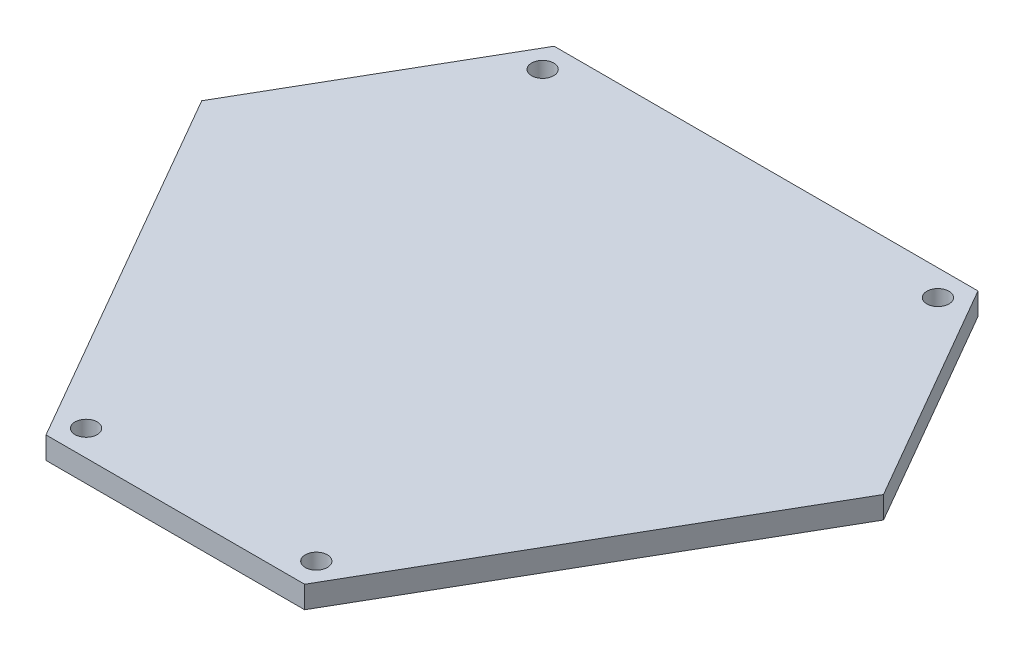
ISO-10303-21;
HEADER;
FILE_DESCRIPTION(('STEP AP214'),'2;1');
FILE_NAME('part.step','',(''),(''),'','','');
FILE_SCHEMA(('AUTOMOTIVE_DESIGN { 1 0 10303 214 1 1 1 1 }'));
ENDSEC;
DATA;
#1=APPLICATION_CONTEXT('core data for automotive mechanical design processes');
#2=APPLICATION_PROTOCOL_DEFINITION('international standard','automotive_design',2000,#1);
#3=PRODUCT_CONTEXT('',#1,'mechanical');
#4=PRODUCT('Part','Part','',(#3));
#5=PRODUCT_RELATED_PRODUCT_CATEGORY('part','',(#4));
#6=PRODUCT_DEFINITION_FORMATION('','',#4);
#7=PRODUCT_DEFINITION_CONTEXT('part definition',#1,'design');
#8=PRODUCT_DEFINITION('design','',#6,#7);
#9=PRODUCT_DEFINITION_SHAPE('','',#8);
#10=(LENGTH_UNIT() NAMED_UNIT(*) SI_UNIT(.MILLI.,.METRE.));
#11=(NAMED_UNIT(*) PLANE_ANGLE_UNIT() SI_UNIT($,.RADIAN.));
#12=(NAMED_UNIT(*) SI_UNIT($,.STERADIAN.) SOLID_ANGLE_UNIT());
#13=UNCERTAINTY_MEASURE_WITH_UNIT(LENGTH_MEASURE(1.E-05),#10,'distance_accuracy_value','');
#14=(GEOMETRIC_REPRESENTATION_CONTEXT(3) GLOBAL_UNCERTAINTY_ASSIGNED_CONTEXT((#13)) GLOBAL_UNIT_ASSIGNED_CONTEXT((#10,
#11,#12)) REPRESENTATION_CONTEXT('',''));
#15=CARTESIAN_POINT('',(0.,0.,0.));
#16=DIRECTION('',(0.,0.,1.));
#17=DIRECTION('',(1.,0.,0.));
#18=AXIS2_PLACEMENT_3D('',#15,#16,#17);
#19=CARTESIAN_POINT('',(0.,3.,-129.9));
#20=DIRECTION('',(-0.866019052628739,0.,0.500011000363013));
#21=DIRECTION('',(0.500011000363013,0.,0.866019052628739));
#22=AXIS2_PLACEMENT_3D('',#19,#20,#21);
#23=PLANE('',#22);
#24=DIRECTION('',(-0.500011000363013,0.,-0.866019052628739));
#25=VECTOR('',#24,1.);
#26=CARTESIAN_POINT('',(0.,0.,-129.9));
#27=LINE('',#26,#25);
#28=CARTESIAN_POINT('',(46.2474247660202,0.,-49.799460305253));
#29=VERTEX_POINT('',#28);
#30=CARTESIAN_POINT('',(28.7426018017677,0.,-80.1178136793383));
#31=VERTEX_POINT('',#30);
#32=EDGE_CURVE('E113',#29,#31,#27,.T.);
#33=ORIENTED_EDGE('',*,*,#32,.T.);
#34=DIRECTION('',(0.,1.,0.));
#35=VECTOR('',#34,1.);
#36=CARTESIAN_POINT('',(28.7426018017677,0.,-80.1178136793383));
#37=LINE('',#36,#35);
#38=CARTESIAN_POINT('',(28.7426018017677,3.,-80.1178136793383));
#39=VERTEX_POINT('',#38);
#40=EDGE_CURVE('E96',#31,#39,#37,.T.);
#41=ORIENTED_EDGE('',*,*,#40,.T.);
#42=DIRECTION('',(-0.500011000363013,0.,-0.866019052628739));
#43=VECTOR('',#42,1.);
#44=CARTESIAN_POINT('',(0.,3.,-129.9));
#45=LINE('',#44,#43);
#46=CARTESIAN_POINT('',(46.2474247660202,3.,-49.799460305253));
#47=VERTEX_POINT('',#46);
#48=EDGE_CURVE('E115',#47,#39,#45,.T.);
#49=ORIENTED_EDGE('',*,*,#48,.F.);
#50=DIRECTION('',(0.,1.,0.));
#51=VECTOR('',#50,1.);
#52=CARTESIAN_POINT('',(46.2474247660202,0.,-49.799460305253));
#53=LINE('',#52,#51);
#54=EDGE_CURVE('E125',#29,#47,#53,.T.);
#55=ORIENTED_EDGE('',*,*,#54,.F.);
#56=EDGE_LOOP('',(#33,#41,#49,#55));
#57=FACE_BOUND('',#56,.T.);
#58=ADVANCED_FACE('F37',(#57),#23,.F.);
#59=CARTESIAN_POINT('',(0.,3.,-129.9));
#60=DIRECTION('',(0.866019052628739,0.,0.500011000363013));
#61=DIRECTION('',(0.500011000363013,0.,-0.866019052628739));
#62=AXIS2_PLACEMENT_3D('',#59,#60,#61);
#63=PLANE('',#62);
#64=DIRECTION('',(-0.500011000363013,0.,0.866019052628739));
#65=VECTOR('',#64,1.);
#66=CARTESIAN_POINT('',(0.,3.,-129.9));
#67=LINE('',#66,#65);
#68=CARTESIAN_POINT('',(-28.7426018017677,3.,-80.1178136793383));
#69=VERTEX_POINT('',#68);
#70=CARTESIAN_POINT('',(-46.2392583536948,3.,-49.8136045314006));
#71=VERTEX_POINT('',#70);
#72=EDGE_CURVE('E45',#69,#71,#67,.T.);
#73=ORIENTED_EDGE('',*,*,#72,.F.);
#74=DIRECTION('',(0.,1.,0.));
#75=VECTOR('',#74,1.);
#76=CARTESIAN_POINT('',(-28.7426018017677,0.,-80.1178136793383));
#77=LINE('',#76,#75);
#78=CARTESIAN_POINT('',(-28.7426018017677,0.,-80.1178136793383));
#79=VERTEX_POINT('',#78);
#80=EDGE_CURVE('E93',#79,#69,#77,.T.);
#81=ORIENTED_EDGE('',*,*,#80,.F.);
#82=DIRECTION('',(-0.500011000363013,0.,0.866019052628739));
#83=VECTOR('',#82,1.);
#84=CARTESIAN_POINT('',(0.,0.,-129.9));
#85=LINE('',#84,#83);
#86=CARTESIAN_POINT('',(-46.2392583536948,0.,-49.8136045314006));
#87=VERTEX_POINT('',#86);
#88=EDGE_CURVE('E107',#79,#87,#85,.T.);
#89=ORIENTED_EDGE('',*,*,#88,.T.);
#90=DIRECTION('',(0.,1.,0.));
#91=VECTOR('',#90,1.);
#92=CARTESIAN_POINT('',(-46.2392583536948,0.,-49.8136045314006));
#93=LINE('',#92,#91);
#94=EDGE_CURVE('E53',#87,#71,#93,.T.);
#95=ORIENTED_EDGE('',*,*,#94,.T.);
#96=EDGE_LOOP('',(#73,#81,#89,#95));
#97=FACE_BOUND('',#96,.T.);
#98=ADVANCED_FACE('F106',(#97),#63,.F.);
#99=CARTESIAN_POINT('',(-75.,3.,0.));
#100=DIRECTION('',(0.,0.,-1.));
#101=DIRECTION('',(-1.,0.,0.));
#102=AXIS2_PLACEMENT_3D('',#99,#100,#101);
#103=PLANE('',#102);
#104=DIRECTION('',(1.,0.,0.));
#105=VECTOR('',#104,1.);
#106=CARTESIAN_POINT('',(-75.,0.,0.));
#107=LINE('',#106,#105);
#108=CARTESIAN_POINT('',(-17.5486076652013,0.,0.));
#109=VERTEX_POINT('',#108);
#110=CARTESIAN_POINT('',(17.5322304145022,0.,0.));
#111=VERTEX_POINT('',#110);
#112=EDGE_CURVE('E40',#109,#111,#107,.T.);
#113=ORIENTED_EDGE('',*,*,#112,.T.);
#114=DIRECTION('',(0.,1.,0.));
#115=VECTOR('',#114,1.);
#116=CARTESIAN_POINT('',(17.5322304145022,0.,0.));
#117=LINE('',#116,#115);
#118=CARTESIAN_POINT('',(17.5322304145022,3.,0.));
#119=VERTEX_POINT('',#118);
#120=EDGE_CURVE('E61',#111,#119,#117,.T.);
#121=ORIENTED_EDGE('',*,*,#120,.T.);
#122=DIRECTION('',(1.,0.,0.));
#123=VECTOR('',#122,1.);
#124=CARTESIAN_POINT('',(-75.,3.,0.));
#125=LINE('',#124,#123);
#126=CARTESIAN_POINT('',(-17.5486076652013,3.,0.));
#127=VERTEX_POINT('',#126);
#128=EDGE_CURVE('E11',#127,#119,#125,.T.);
#129=ORIENTED_EDGE('',*,*,#128,.F.);
#130=DIRECTION('',(0.,1.,0.));
#131=VECTOR('',#130,1.);
#132=CARTESIAN_POINT('',(-17.5486076652013,0.,0.));
#133=LINE('',#132,#131);
#134=EDGE_CURVE('E123',#109,#127,#133,.T.);
#135=ORIENTED_EDGE('',*,*,#134,.F.);
#136=EDGE_LOOP('',(#113,#121,#129,#135));
#137=FACE_BOUND('',#136,.T.);
#138=ADVANCED_FACE('F173',(#137),#103,.F.);
#139=CARTESIAN_POINT('',(0.,3.,0.));
#140=DIRECTION('',(0.,-1.,0.));
#141=DIRECTION('',(0.,0.,-1.));
#142=AXIS2_PLACEMENT_3D('',#139,#140,#141);
#143=PLANE('',#142);
#144=CARTESIAN_POINT('',(-26.806110128664,3.,-76.6178136793383));
#145=DIRECTION('',(0.,1.,0.));
#146=DIRECTION('',(0.,0.,1.));
#147=AXIS2_PLACEMENT_3D('',#144,#145,#146);
#148=CIRCLE('',#147,1.5);
#149=CARTESIAN_POINT('',(-26.806110128664,3.,-75.1178136793383));
#150=VERTEX_POINT('',#149);
#151=EDGE_CURVE('E150',#150,#150,#148,.T.);
#152=ORIENTED_EDGE('',*,*,#151,.F.);
#153=EDGE_LOOP('',(#152));
#154=FACE_BOUND('',#153,.T.);
#155=CARTESIAN_POINT('',(15.6121159920976,3.,-3.5));
#156=DIRECTION('',(0.,1.,0.));
#157=DIRECTION('',(0.,0.,-1.));
#158=AXIS2_PLACEMENT_3D('',#155,#156,#157);
#159=CIRCLE('',#158,1.5);
#160=CARTESIAN_POINT('',(15.6121159920976,3.,-5.));
#161=VERTEX_POINT('',#160);
#162=EDGE_CURVE('E141',#161,#161,#159,.T.);
#163=ORIENTED_EDGE('',*,*,#162,.F.);
#164=EDGE_LOOP('',(#163));
#165=FACE_BOUND('',#164,.T.);
#166=CARTESIAN_POINT('',(-15.6121159920976,3.,-3.5));
#167=DIRECTION('',(0.,1.,0.));
#168=DIRECTION('',(0.,0.,1.));
#169=AXIS2_PLACEMENT_3D('',#166,#167,#168);
#170=CIRCLE('',#169,1.5);
#171=CARTESIAN_POINT('',(-15.6121159920976,3.,-2.00000000000001));
#172=VERTEX_POINT('',#171);
#173=EDGE_CURVE('E140',#172,#172,#170,.T.);
#174=ORIENTED_EDGE('',*,*,#173,.F.);
#175=EDGE_LOOP('',(#174));
#176=FACE_BOUND('',#175,.T.);
#177=CARTESIAN_POINT('',(26.806110128664,3.,-76.6178136793383));
#178=DIRECTION('',(0.,1.,0.));
#179=DIRECTION('',(0.,0.,-1.));
#180=AXIS2_PLACEMENT_3D('',#177,#178,#179);
#181=CIRCLE('',#180,1.5);
#182=CARTESIAN_POINT('',(26.806110128664,3.,-78.1178136793383));
#183=VERTEX_POINT('',#182);
#184=EDGE_CURVE('E147',#183,#183,#181,.T.);
#185=ORIENTED_EDGE('',*,*,#184,.F.);
#186=EDGE_LOOP('',(#185));
#187=FACE_BOUND('',#186,.T.);
#188=ORIENTED_EDGE('',*,*,#48,.T.);
#189=DIRECTION('',(1.,0.,0.));
#190=VECTOR('',#189,1.);
#191=CARTESIAN_POINT('',(-28.7426018017677,3.,-80.1178136793383));
#192=LINE('',#191,#190);
#193=EDGE_CURVE('E101',#69,#39,#192,.T.);
#194=ORIENTED_EDGE('',*,*,#193,.F.);
#195=ORIENTED_EDGE('',*,*,#72,.T.);
#196=DIRECTION('',(-0.499096269822187,0.,-0.866546544306524));
#197=VECTOR('',#196,1.);
#198=CARTESIAN_POINT('',(-46.2392583536948,3.,-49.8136045314006));
#199=LINE('',#198,#197);
#200=EDGE_CURVE('E122',#127,#71,#199,.T.);
#201=ORIENTED_EDGE('',*,*,#200,.F.);
#202=ORIENTED_EDGE('',*,*,#128,.T.);
#203=DIRECTION('',(-0.499523226003708,0.,0.866300494449154));
#204=VECTOR('',#203,1.);
#205=CARTESIAN_POINT('',(46.2474247660202,3.,-49.799460305253));
#206=LINE('',#205,#204);
#207=EDGE_CURVE('E131',#47,#119,#206,.T.);
#208=ORIENTED_EDGE('',*,*,#207,.F.);
#209=EDGE_LOOP('',(#188,#194,#195,#201,#202,#208));
#210=FACE_BOUND('',#209,.T.);
#211=ADVANCED_FACE('F170',(#154,#165,#176,#187,#210),#143,.F.);
#212=CARTESIAN_POINT('',(0.,0.,0.));
#213=DIRECTION('',(0.,-1.,0.));
#214=DIRECTION('',(0.,0.,-1.));
#215=AXIS2_PLACEMENT_3D('',#212,#213,#214);
#216=PLANE('',#215);
#217=CARTESIAN_POINT('',(-26.806110128664,0.,-76.6178136793383));
#218=DIRECTION('',(0.,1.,0.));
#219=DIRECTION('',(0.,0.,1.));
#220=AXIS2_PLACEMENT_3D('',#217,#218,#219);
#221=CIRCLE('',#220,1.5);
#222=CARTESIAN_POINT('',(-26.806110128664,0.,-75.1178136793383));
#223=VERTEX_POINT('',#222);
#224=EDGE_CURVE('E127',#223,#223,#221,.T.);
#225=ORIENTED_EDGE('',*,*,#224,.T.);
#226=EDGE_LOOP('',(#225));
#227=FACE_BOUND('',#226,.T.);
#228=CARTESIAN_POINT('',(15.6121159920976,0.,-3.5));
#229=DIRECTION('',(0.,1.,0.));
#230=DIRECTION('',(0.,0.,-1.));
#231=AXIS2_PLACEMENT_3D('',#228,#229,#230);
#232=CIRCLE('',#231,1.5);
#233=CARTESIAN_POINT('',(15.6121159920976,0.,-5.));
#234=VERTEX_POINT('',#233);
#235=EDGE_CURVE('E151',#234,#234,#232,.T.);
#236=ORIENTED_EDGE('',*,*,#235,.T.);
#237=EDGE_LOOP('',(#236));
#238=FACE_BOUND('',#237,.T.);
#239=CARTESIAN_POINT('',(-15.6121159920976,0.,-3.5));
#240=DIRECTION('',(0.,1.,0.));
#241=DIRECTION('',(0.,0.,1.));
#242=AXIS2_PLACEMENT_3D('',#239,#240,#241);
#243=CIRCLE('',#242,1.5);
#244=CARTESIAN_POINT('',(-15.6121159920976,0.,-2.00000000000001));
#245=VERTEX_POINT('',#244);
#246=EDGE_CURVE('E137',#245,#245,#243,.T.);
#247=ORIENTED_EDGE('',*,*,#246,.T.);
#248=EDGE_LOOP('',(#247));
#249=FACE_BOUND('',#248,.T.);
#250=CARTESIAN_POINT('',(26.806110128664,0.,-76.6178136793383));
#251=DIRECTION('',(0.,1.,0.));
#252=DIRECTION('',(0.,0.,-1.));
#253=AXIS2_PLACEMENT_3D('',#250,#251,#252);
#254=CIRCLE('',#253,1.5);
#255=CARTESIAN_POINT('',(26.806110128664,0.,-78.1178136793383));
#256=VERTEX_POINT('',#255);
#257=EDGE_CURVE('E144',#256,#256,#254,.T.);
#258=ORIENTED_EDGE('',*,*,#257,.T.);
#259=EDGE_LOOP('',(#258));
#260=FACE_BOUND('',#259,.T.);
#261=DIRECTION('',(1.,0.,0.));
#262=VECTOR('',#261,1.);
#263=CARTESIAN_POINT('',(-28.7426018017677,0.,-80.1178136793383));
#264=LINE('',#263,#262);
#265=EDGE_CURVE('E90',#79,#31,#264,.T.);
#266=ORIENTED_EDGE('',*,*,#265,.T.);
#267=ORIENTED_EDGE('',*,*,#32,.F.);
#268=DIRECTION('',(-0.499523226003708,0.,0.866300494449154));
#269=VECTOR('',#268,1.);
#270=CARTESIAN_POINT('',(46.2474247660202,0.,-49.799460305253));
#271=LINE('',#270,#269);
#272=EDGE_CURVE('E129',#29,#111,#271,.T.);
#273=ORIENTED_EDGE('',*,*,#272,.T.);
#274=ORIENTED_EDGE('',*,*,#112,.F.);
#275=DIRECTION('',(-0.499096269822187,0.,-0.866546544306524));
#276=VECTOR('',#275,1.);
#277=CARTESIAN_POINT('',(-46.2392583536948,0.,-49.8136045314006));
#278=LINE('',#277,#276);
#279=EDGE_CURVE('E112',#109,#87,#278,.T.);
#280=ORIENTED_EDGE('',*,*,#279,.T.);
#281=ORIENTED_EDGE('',*,*,#88,.F.);
#282=EDGE_LOOP('',(#266,#267,#273,#274,#280,#281));
#283=FACE_BOUND('',#282,.T.);
#284=ADVANCED_FACE('F110',(#227,#238,#249,#260,#283),#216,.T.);
#285=CARTESIAN_POINT('',(-46.2392583536948,0.,-49.8136045314006));
#286=DIRECTION('',(0.866546544306524,0.,-0.499096269822187));
#287=DIRECTION('',(-0.499096269822187,0.,-0.866546544306524));
#288=AXIS2_PLACEMENT_3D('',#285,#286,#287);
#289=PLANE('',#288);
#290=ORIENTED_EDGE('',*,*,#200,.T.);
#291=ORIENTED_EDGE('',*,*,#94,.F.);
#292=ORIENTED_EDGE('',*,*,#279,.F.);
#293=ORIENTED_EDGE('',*,*,#134,.T.);
#294=EDGE_LOOP('',(#290,#291,#292,#293));
#295=FACE_BOUND('',#294,.T.);
#296=ADVANCED_FACE('F189',(#295),#289,.F.);
#297=CARTESIAN_POINT('',(46.2474247660202,0.,-49.799460305253));
#298=DIRECTION('',(-0.866300494449154,0.,-0.499523226003708));
#299=DIRECTION('',(-0.499523226003708,0.,0.866300494449154));
#300=AXIS2_PLACEMENT_3D('',#297,#298,#299);
#301=PLANE('',#300);
#302=ORIENTED_EDGE('',*,*,#207,.T.);
#303=ORIENTED_EDGE('',*,*,#120,.F.);
#304=ORIENTED_EDGE('',*,*,#272,.F.);
#305=ORIENTED_EDGE('',*,*,#54,.T.);
#306=EDGE_LOOP('',(#302,#303,#304,#305));
#307=FACE_BOUND('',#306,.T.);
#308=ADVANCED_FACE('F191',(#307),#301,.F.);
#309=CARTESIAN_POINT('',(-28.7426018017677,0.,-80.1178136793383));
#310=DIRECTION('',(0.,0.,1.));
#311=DIRECTION('',(1.,0.,0.));
#312=AXIS2_PLACEMENT_3D('',#309,#310,#311);
#313=PLANE('',#312);
#314=ORIENTED_EDGE('',*,*,#193,.T.);
#315=ORIENTED_EDGE('',*,*,#40,.F.);
#316=ORIENTED_EDGE('',*,*,#265,.F.);
#317=ORIENTED_EDGE('',*,*,#80,.T.);
#318=EDGE_LOOP('',(#314,#315,#316,#317));
#319=FACE_BOUND('',#318,.T.);
#320=ADVANCED_FACE('F92',(#319),#313,.F.);
#321=CARTESIAN_POINT('',(26.806110128664,0.,-76.6178136793383));
#322=DIRECTION('',(0.,1.,0.));
#323=DIRECTION('',(0.,0.,1.));
#324=AXIS2_PLACEMENT_3D('',#321,#322,#323);
#325=CYLINDRICAL_SURFACE('',#324,1.5);
#326=ORIENTED_EDGE('',*,*,#257,.F.);
#327=EDGE_LOOP('',(#326));
#328=FACE_BOUND('',#327,.T.);
#329=ORIENTED_EDGE('',*,*,#184,.T.);
#330=EDGE_LOOP('',(#329));
#331=FACE_BOUND('',#330,.T.);
#332=ADVANCED_FACE('F225',(#328,#331),#325,.F.);
#333=CARTESIAN_POINT('',(-15.6121159920976,0.,-3.5));
#334=DIRECTION('',(0.,1.,0.));
#335=DIRECTION('',(0.,0.,1.));
#336=AXIS2_PLACEMENT_3D('',#333,#334,#335);
#337=CYLINDRICAL_SURFACE('',#336,1.5);
#338=ORIENTED_EDGE('',*,*,#246,.F.);
#339=EDGE_LOOP('',(#338));
#340=FACE_BOUND('',#339,.T.);
#341=ORIENTED_EDGE('',*,*,#173,.T.);
#342=EDGE_LOOP('',(#341));
#343=FACE_BOUND('',#342,.T.);
#344=ADVANCED_FACE('F230',(#340,#343),#337,.F.);
#345=CARTESIAN_POINT('',(15.6121159920976,0.,-3.5));
#346=DIRECTION('',(0.,1.,0.));
#347=DIRECTION('',(0.,0.,1.));
#348=AXIS2_PLACEMENT_3D('',#345,#346,#347);
#349=CYLINDRICAL_SURFACE('',#348,1.5);
#350=ORIENTED_EDGE('',*,*,#235,.F.);
#351=EDGE_LOOP('',(#350));
#352=FACE_BOUND('',#351,.T.);
#353=ORIENTED_EDGE('',*,*,#162,.T.);
#354=EDGE_LOOP('',(#353));
#355=FACE_BOUND('',#354,.T.);
#356=ADVANCED_FACE('F166',(#352,#355),#349,.F.);
#357=CARTESIAN_POINT('',(-26.806110128664,0.,-76.6178136793383));
#358=DIRECTION('',(0.,1.,0.));
#359=DIRECTION('',(0.,0.,1.));
#360=AXIS2_PLACEMENT_3D('',#357,#358,#359);
#361=CYLINDRICAL_SURFACE('',#360,1.5);
#362=ORIENTED_EDGE('',*,*,#224,.F.);
#363=EDGE_LOOP('',(#362));
#364=FACE_BOUND('',#363,.T.);
#365=ORIENTED_EDGE('',*,*,#151,.T.);
#366=EDGE_LOOP('',(#365));
#367=FACE_BOUND('',#366,.T.);
#368=ADVANCED_FACE('F163',(#364,#367),#361,.F.);
#369=CLOSED_SHELL('',(#58,#98,#138,#211,#284,#296,#308,#320,#332,#344,#356,#368));
#370=MANIFOLD_SOLID_BREP('B2',#369);
#371=ADVANCED_BREP_SHAPE_REPRESENTATION('',(#18,#370),#14);
#372=SHAPE_DEFINITION_REPRESENTATION(#9,#371);
ENDSEC;
END-ISO-10303-21;
